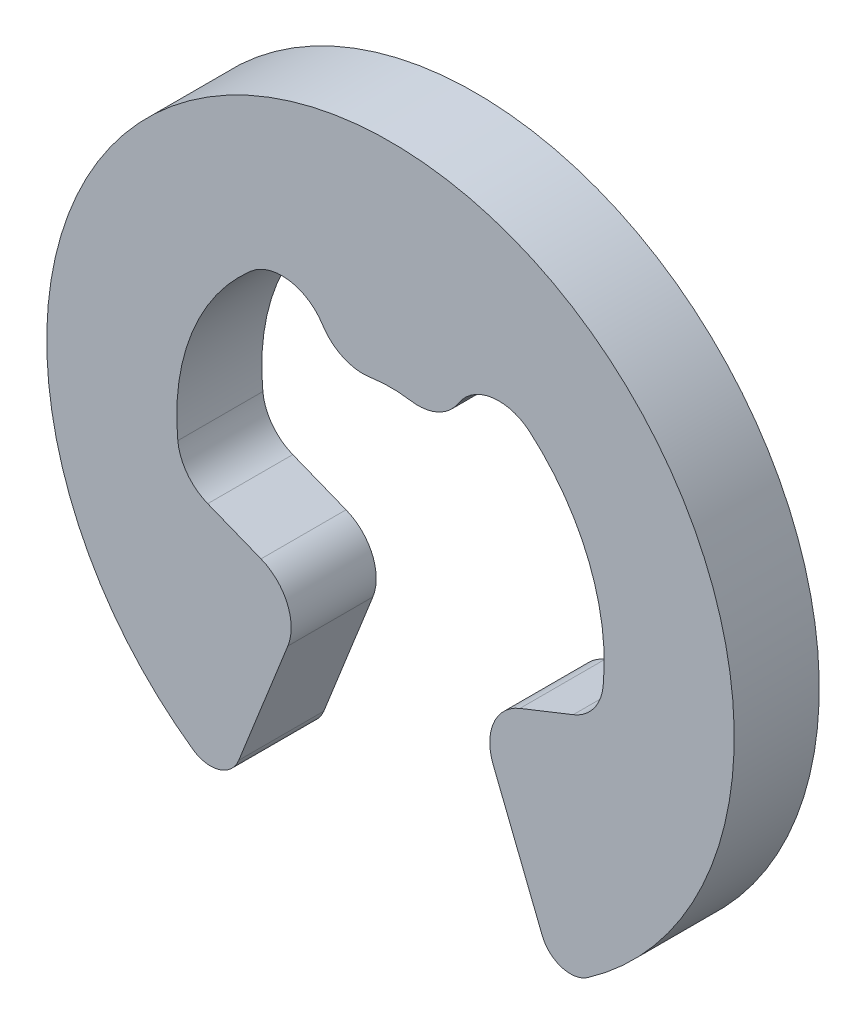
ISO-10303-21;
HEADER;
FILE_DESCRIPTION(('STEP AP214'),'2;1');
FILE_NAME('part.step','',(''),(''),'','','');
FILE_SCHEMA(('AUTOMOTIVE_DESIGN { 1 0 10303 214 1 1 1 1 }'));
ENDSEC;
DATA;
#1=APPLICATION_CONTEXT('core data for automotive mechanical design processes');
#2=APPLICATION_PROTOCOL_DEFINITION('international standard','automotive_design',2000,#1);
#3=PRODUCT_CONTEXT('',#1,'mechanical');
#4=PRODUCT('Part','Part','',(#3));
#5=PRODUCT_RELATED_PRODUCT_CATEGORY('part','',(#4));
#6=PRODUCT_DEFINITION_FORMATION('','',#4);
#7=PRODUCT_DEFINITION_CONTEXT('part definition',#1,'design');
#8=PRODUCT_DEFINITION('design','',#6,#7);
#9=PRODUCT_DEFINITION_SHAPE('','',#8);
#10=(LENGTH_UNIT() NAMED_UNIT(*) SI_UNIT(.MILLI.,.METRE.));
#11=(NAMED_UNIT(*) PLANE_ANGLE_UNIT() SI_UNIT($,.RADIAN.));
#12=(NAMED_UNIT(*) SI_UNIT($,.STERADIAN.) SOLID_ANGLE_UNIT());
#13=UNCERTAINTY_MEASURE_WITH_UNIT(LENGTH_MEASURE(1.E-05),#10,'distance_accuracy_value','');
#14=(GEOMETRIC_REPRESENTATION_CONTEXT(3) GLOBAL_UNCERTAINTY_ASSIGNED_CONTEXT((#13)) GLOBAL_UNIT_ASSIGNED_CONTEXT((#10,
#11,#12)) REPRESENTATION_CONTEXT('',''));
#15=CARTESIAN_POINT('',(0.,0.,0.));
#16=DIRECTION('',(0.,0.,1.));
#17=DIRECTION('',(1.,0.,0.));
#18=AXIS2_PLACEMENT_3D('',#15,#16,#17);
#19=CARTESIAN_POINT('',(0.,0.143506110626121,0.584199999999979));
#20=DIRECTION('',(0.,0.,1.));
#21=DIRECTION('',(1.,0.,0.));
#22=AXIS2_PLACEMENT_3D('',#19,#20,#21);
#23=PLANE('',#22);
#24=CARTESIAN_POINT('',(-1.72616725235582,-0.173879579426703,0.584199999999979));
#25=DIRECTION('',(0.,0.,1.));
#26=DIRECTION('',(1.,0.,0.));
#27=AXIS2_PLACEMENT_3D('',#24,#25,#26);
#28=CIRCLE('',#27,0.500000000000007);
#29=CARTESIAN_POINT('',(-1.91077670836398,-0.638550805943228,0.584199999999979));
#30=VERTEX_POINT('',#29);
#31=CARTESIAN_POINT('',(-2.22364968177859,-0.223991777698424,0.584199999999979));
#32=VERTEX_POINT('',#31);
#33=EDGE_CURVE('E161',#30,#32,#28,.F.);
#34=ORIENTED_EDGE('',*,*,#33,.T.);
#35=CARTESIAN_POINT('',(0.,0.,0.584199999999979));
#36=DIRECTION('',(0.,0.,1.));
#37=DIRECTION('',(1.,0.,0.));
#38=AXIS2_PLACEMENT_3D('',#35,#36,#37);
#39=CIRCLE('',#38,2.23490273250325);
#40=CARTESIAN_POINT('',(-1.4592169871897,1.69277169401179,0.584199999999979));
#41=VERTEX_POINT('',#40);
#42=EDGE_CURVE('E159',#32,#41,#39,.F.);
#43=ORIENTED_EDGE('',*,*,#42,.T.);
#44=CARTESIAN_POINT('',(-1.13275602627905,1.31405908397444,0.584199999999979));
#45=DIRECTION('',(0.,0.,1.));
#46=DIRECTION('',(1.,0.,0.));
#47=AXIS2_PLACEMENT_3D('',#44,#45,#46);
#48=CIRCLE('',#47,0.500000000000007);
#49=CARTESIAN_POINT('',(-0.715008346814609,1.58880783520379,0.584199999999979));
#50=VERTEX_POINT('',#49);
#51=EDGE_CURVE('E20',#41,#50,#48,.F.);
#52=ORIENTED_EDGE('',*,*,#51,.T.);
#53=DIRECTION('',(0.549497502458702,-0.835495358928851,0.));
#54=VECTOR('',#53,1.);
#55=CARTESIAN_POINT('',(-0.715008346814601,1.58880783520378,0.584199999999979));
#56=LINE('',#55,#54);
#57=CARTESIAN_POINT('',(-0.705647848949969,1.57457546383144,0.584199999999979));
#58=VERTEX_POINT('',#57);
#59=EDGE_CURVE('E157',#50,#58,#56,.T.);
#60=ORIENTED_EDGE('',*,*,#59,.T.);
#61=CARTESIAN_POINT('',(-0.28790016948553,1.84932421506079,0.584199999999979));
#62=DIRECTION('',(0.,0.,1.));
#63=DIRECTION('',(1.,0.,0.));
#64=AXIS2_PLACEMENT_3D('',#61,#62,#63);
#65=CIRCLE('',#64,0.500000000000007);
#66=CARTESIAN_POINT('',(-0.210987322326542,1.35527521552542,0.584199999999979));
#67=VERTEX_POINT('',#66);
#68=EDGE_CURVE('E231',#67,#58,#65,.F.);
#69=ORIENTED_EDGE('',*,*,#68,.F.);
#70=CARTESIAN_POINT('',(0.,0.,0.584199999999979));
#71=DIRECTION('',(0.,0.,1.));
#72=DIRECTION('',(1.,0.,0.));
#73=AXIS2_PLACEMENT_3D('',#70,#71,#72);
#74=CIRCLE('',#73,1.3716);
#75=CARTESIAN_POINT('',(0.210987322326542,1.35527521552541,0.584199999999979));
#76=VERTEX_POINT('',#75);
#77=EDGE_CURVE('E230',#67,#76,#74,.F.);
#78=ORIENTED_EDGE('',*,*,#77,.T.);
#79=CARTESIAN_POINT('',(0.28790016948553,1.84932421506079,0.584199999999979));
#80=DIRECTION('',(0.,0.,1.));
#81=DIRECTION('',(1.,0.,0.));
#82=AXIS2_PLACEMENT_3D('',#79,#80,#81);
#83=CIRCLE('',#82,0.500000000000007);
#84=CARTESIAN_POINT('',(0.705647848949927,1.57457546383136,0.584199999999979));
#85=VERTEX_POINT('',#84);
#86=EDGE_CURVE('E226',#85,#76,#83,.F.);
#87=ORIENTED_EDGE('',*,*,#86,.F.);
#88=DIRECTION('',(0.549497502458841,0.835495358928759,0.));
#89=VECTOR('',#88,1.);
#90=CARTESIAN_POINT('',(0.98838354154001,2.00446706098237,0.584199999999979));
#91=LINE('',#90,#89);
#92=CARTESIAN_POINT('',(0.715008346814638,1.58880783520382,0.584199999999979));
#93=VERTEX_POINT('',#92);
#94=EDGE_CURVE('E223',#93,#85,#91,.F.);
#95=ORIENTED_EDGE('',*,*,#94,.F.);
#96=CARTESIAN_POINT('',(1.13275602627905,1.31405908397444,0.584199999999979));
#97=DIRECTION('',(0.,0.,1.));
#98=DIRECTION('',(1.,0.,0.));
#99=AXIS2_PLACEMENT_3D('',#96,#97,#98);
#100=CIRCLE('',#99,0.500000000000007);
#101=CARTESIAN_POINT('',(1.4592169871897,1.69277169401178,0.584199999999979));
#102=VERTEX_POINT('',#101);
#103=EDGE_CURVE('E217',#93,#102,#100,.F.);
#104=ORIENTED_EDGE('',*,*,#103,.T.);
#105=CARTESIAN_POINT('',(0.,0.,0.584199999999979));
#106=DIRECTION('',(0.,0.,1.));
#107=DIRECTION('',(1.,0.,0.));
#108=AXIS2_PLACEMENT_3D('',#105,#106,#107);
#109=CIRCLE('',#108,2.23490273250325);
#110=CARTESIAN_POINT('',(2.22364968177859,-0.223991777698424,0.584199999999979));
#111=VERTEX_POINT('',#110);
#112=EDGE_CURVE('E213',#102,#111,#109,.F.);
#113=ORIENTED_EDGE('',*,*,#112,.T.);
#114=CARTESIAN_POINT('',(1.72616725235582,-0.173879579426703,0.584199999999979));
#115=DIRECTION('',(0.,0.,1.));
#116=DIRECTION('',(1.,0.,0.));
#117=AXIS2_PLACEMENT_3D('',#114,#115,#116);
#118=CIRCLE('',#117,0.500000000000007);
#119=CARTESIAN_POINT('',(1.91077670836398,-0.63855080594322,0.584199999999979));
#120=VERTEX_POINT('',#119);
#121=EDGE_CURVE('E212',#111,#120,#118,.F.);
#122=ORIENTED_EDGE('',*,*,#121,.T.);
#123=DIRECTION('',(-0.929342453033051,-0.369218912016315,0.));
#124=VECTOR('',#123,1.);
#125=CARTESIAN_POINT('',(0.889000000000001,-1.04449296790356,0.584199999999979));
#126=LINE('',#125,#124);
#127=CARTESIAN_POINT('',(1.35367122651652,-0.859883511895409,0.584199999999979));
#128=VERTEX_POINT('',#127);
#129=EDGE_CURVE('E208',#128,#120,#126,.F.);
#130=ORIENTED_EDGE('',*,*,#129,.F.);
#131=CARTESIAN_POINT('',(1.53828068252469,-1.32455473841195,0.584199999999979));
#132=DIRECTION('',(0.,0.,1.));
#133=DIRECTION('',(1.,0.,0.));
#134=AXIS2_PLACEMENT_3D('',#131,#132,#133);
#135=CIRCLE('',#134,0.500000000000007);
#136=CARTESIAN_POINT('',(1.07360945600816,-1.5091641944201,0.584199999999979));
#137=VERTEX_POINT('',#136);
#138=EDGE_CURVE('E205',#137,#128,#135,.F.);
#139=ORIENTED_EDGE('',*,*,#138,.F.);
#140=DIRECTION('',(0.369218912016316,-0.929342453033051,0.));
#141=VECTOR('',#140,1.);
#142=CARTESIAN_POINT('',(1.58637370049063,-2.79981742286013,0.584199999999979));
#143=LINE('',#142,#141);
#144=CARTESIAN_POINT('',(1.58637370049063,-2.79981742286013,0.584199999999979));
#145=VERTEX_POINT('',#144);
#146=EDGE_CURVE('E202',#145,#137,#143,.F.);
#147=ORIENTED_EDGE('',*,*,#146,.F.);
#148=CARTESIAN_POINT('',(1.88143992932862,-2.68259041829494,0.584199999999979));
#149=DIRECTION('',(0.,0.,1.));
#150=DIRECTION('',(1.,0.,0.));
#151=AXIS2_PLACEMENT_3D('',#148,#149,#150);
#152=CIRCLE('',#151,0.3175);
#153=CARTESIAN_POINT('',(2.06375,-2.94253135030028,0.584199999999979));
#154=VERTEX_POINT('',#153);
#155=EDGE_CURVE('E199',#154,#145,#152,.F.);
#156=ORIENTED_EDGE('',*,*,#155,.F.);
#157=CARTESIAN_POINT('',(0.,0.,0.584199999999979));
#158=DIRECTION('',(0.,0.,1.));
#159=DIRECTION('',(1.,0.,0.));
#160=AXIS2_PLACEMENT_3D('',#157,#158,#159);
#161=CIRCLE('',#160,3.5941);
#162=CARTESIAN_POINT('',(-2.06375,-2.94253135030027,0.584199999999979));
#163=VERTEX_POINT('',#162);
#164=EDGE_CURVE('E196',#163,#154,#161,.F.);
#165=ORIENTED_EDGE('',*,*,#164,.F.);
#166=CARTESIAN_POINT('',(-1.88143992932862,-2.68259041829494,0.584199999999979));
#167=DIRECTION('',(0.,0.,1.));
#168=DIRECTION('',(1.,0.,0.));
#169=AXIS2_PLACEMENT_3D('',#166,#167,#168);
#170=CIRCLE('',#169,0.3175);
#171=CARTESIAN_POINT('',(-1.58637370049063,-2.79981742286013,0.584199999999979));
#172=VERTEX_POINT('',#171);
#173=EDGE_CURVE('E193',#172,#163,#170,.F.);
#174=ORIENTED_EDGE('',*,*,#173,.F.);
#175=DIRECTION('',(0.369218912016315,0.929342453033051,0.));
#176=VECTOR('',#175,1.);
#177=CARTESIAN_POINT('',(-0.889000000000001,-1.04449296790356,0.584199999999979));
#178=LINE('',#177,#176);
#179=CARTESIAN_POINT('',(-1.07360945600816,-1.5091641944201,0.584199999999979));
#180=VERTEX_POINT('',#179);
#181=EDGE_CURVE('E187',#180,#172,#178,.F.);
#182=ORIENTED_EDGE('',*,*,#181,.F.);
#183=CARTESIAN_POINT('',(-1.53828068252469,-1.32455473841195,0.584199999999979));
#184=DIRECTION('',(0.,0.,1.));
#185=DIRECTION('',(1.,0.,0.));
#186=AXIS2_PLACEMENT_3D('',#183,#184,#185);
#187=CIRCLE('',#186,0.500000000000007);
#188=CARTESIAN_POINT('',(-1.35367122651652,-0.859883511895401,0.584199999999979));
#189=VERTEX_POINT('',#188);
#190=EDGE_CURVE('E184',#189,#180,#187,.F.);
#191=ORIENTED_EDGE('',*,*,#190,.F.);
#192=DIRECTION('',(-0.929342453033051,0.369218912016315,0.));
#193=VECTOR('',#192,1.);
#194=CARTESIAN_POINT('',(-2.16976024988989,-0.535659109647355,0.584199999999979));
#195=LINE('',#194,#193);
#196=EDGE_CURVE('E180',#30,#189,#195,.F.);
#197=ORIENTED_EDGE('',*,*,#196,.F.);
#198=EDGE_LOOP('',(#34,#43,#52,#60,#69,#78,#87,#95,#104,#113,#122,#130,#139,#147,#156,#165,#174,
#182,#191,#197));
#199=FACE_BOUND('',#198,.T.);
#200=ADVANCED_FACE('F17',(#199),#23,.T.);
#201=CARTESIAN_POINT('',(-0.28790016948553,1.84932421506079,0.));
#202=DIRECTION('',(0.,0.,1.));
#203=DIRECTION('',(1.,0.,0.));
#204=AXIS2_PLACEMENT_3D('',#201,#202,#203);
#205=CYLINDRICAL_SURFACE('',#204,0.500000000000007);
#206=ORIENTED_EDGE('',*,*,#68,.T.);
#207=DIRECTION('',(0.,0.,1.));
#208=VECTOR('',#207,1.);
#209=CARTESIAN_POINT('',(-0.705647848949976,1.57457546383145,0.));
#210=LINE('',#209,#208);
#211=CARTESIAN_POINT('',(-0.705647848949969,1.57457546383144,-0.304799999999994));
#212=VERTEX_POINT('',#211);
#213=EDGE_CURVE('E170',#212,#58,#210,.T.);
#214=ORIENTED_EDGE('',*,*,#213,.F.);
#215=CARTESIAN_POINT('',(-0.28790016948553,1.84932421506079,-0.304799999999994));
#216=DIRECTION('',(0.,0.,1.));
#217=DIRECTION('',(1.,0.,0.));
#218=AXIS2_PLACEMENT_3D('',#215,#216,#217);
#219=CIRCLE('',#218,0.500000000000007);
#220=CARTESIAN_POINT('',(-0.210987322326542,1.35527521552542,-0.304799999999994));
#221=VERTEX_POINT('',#220);
#222=EDGE_CURVE('E277',#212,#221,#219,.T.);
#223=ORIENTED_EDGE('',*,*,#222,.T.);
#224=DIRECTION('',(0.,0.,1.));
#225=VECTOR('',#224,1.);
#226=CARTESIAN_POINT('',(-0.210987322326543,1.35527521552542,0.));
#227=LINE('',#226,#225);
#228=EDGE_CURVE('E227',#221,#67,#227,.T.);
#229=ORIENTED_EDGE('',*,*,#228,.T.);
#230=EDGE_LOOP('',(#206,#214,#223,#229));
#231=FACE_BOUND('',#230,.T.);
#232=ADVANCED_FACE('F296',(#231),#205,.T.);
#233=CARTESIAN_POINT('',(0.,0.,0.));
#234=DIRECTION('',(0.,0.,1.));
#235=DIRECTION('',(1.,0.,0.));
#236=AXIS2_PLACEMENT_3D('',#233,#234,#235);
#237=CYLINDRICAL_SURFACE('',#236,1.3716);
#238=DIRECTION('',(0.,0.,1.));
#239=VECTOR('',#238,1.);
#240=CARTESIAN_POINT('',(0.210987322326544,1.35527521552541,0.));
#241=LINE('',#240,#239);
#242=CARTESIAN_POINT('',(0.210987322326542,1.35527521552541,-0.304799999999994));
#243=VERTEX_POINT('',#242);
#244=EDGE_CURVE('E224',#76,#243,#241,.F.);
#245=ORIENTED_EDGE('',*,*,#244,.F.);
#246=ORIENTED_EDGE('',*,*,#77,.F.);
#247=ORIENTED_EDGE('',*,*,#228,.F.);
#248=CARTESIAN_POINT('',(0.,0.,-0.304799999999994));
#249=DIRECTION('',(0.,0.,1.));
#250=DIRECTION('',(1.,0.,0.));
#251=AXIS2_PLACEMENT_3D('',#248,#249,#250);
#252=CIRCLE('',#251,1.3716);
#253=EDGE_CURVE('E274',#221,#243,#252,.F.);
#254=ORIENTED_EDGE('',*,*,#253,.T.);
#255=EDGE_LOOP('',(#245,#246,#247,#254));
#256=FACE_BOUND('',#255,.T.);
#257=ADVANCED_FACE('F306',(#256),#237,.F.);
#258=CARTESIAN_POINT('',(0.28790016948553,1.84932421506079,0.));
#259=DIRECTION('',(0.,0.,1.));
#260=DIRECTION('',(1.,0.,0.));
#261=AXIS2_PLACEMENT_3D('',#258,#259,#260);
#262=CYLINDRICAL_SURFACE('',#261,0.500000000000007);
#263=ORIENTED_EDGE('',*,*,#86,.T.);
#264=ORIENTED_EDGE('',*,*,#244,.T.);
#265=CARTESIAN_POINT('',(0.28790016948553,1.84932421506079,-0.304799999999994));
#266=DIRECTION('',(0.,0.,1.));
#267=DIRECTION('',(1.,0.,0.));
#268=AXIS2_PLACEMENT_3D('',#265,#266,#267);
#269=CIRCLE('',#268,0.500000000000007);
#270=CARTESIAN_POINT('',(0.705647848949993,1.57457546383147,-0.304799999999994));
#271=VERTEX_POINT('',#270);
#272=EDGE_CURVE('E271',#243,#271,#269,.T.);
#273=ORIENTED_EDGE('',*,*,#272,.T.);
#274=DIRECTION('',(0.,0.,1.));
#275=VECTOR('',#274,1.);
#276=CARTESIAN_POINT('',(0.705647848949927,1.57457546383136,0.));
#277=LINE('',#276,#275);
#278=EDGE_CURVE('E221',#85,#271,#277,.F.);
#279=ORIENTED_EDGE('',*,*,#278,.F.);
#280=EDGE_LOOP('',(#263,#264,#273,#279));
#281=FACE_BOUND('',#280,.T.);
#282=ADVANCED_FACE('F311',(#281),#262,.T.);
#283=CARTESIAN_POINT('',(0.98838354154001,2.00446706098237,0.));
#284=DIRECTION('',(0.835495358928759,-0.549497502458841,0.));
#285=DIRECTION('',(0.549497502458841,0.835495358928759,0.));
#286=AXIS2_PLACEMENT_3D('',#283,#284,#285);
#287=PLANE('',#286);
#288=ORIENTED_EDGE('',*,*,#278,.T.);
#289=DIRECTION('',(0.549497502458418,0.835495358929038,0.));
#290=VECTOR('',#289,1.);
#291=CARTESIAN_POINT('',(0.705647848949983,1.57457546383145,-0.304799999999994));
#292=LINE('',#291,#290);
#293=CARTESIAN_POINT('',(0.715008346814562,1.58880783520372,-0.304799999999994));
#294=VERTEX_POINT('',#293);
#295=EDGE_CURVE('E270',#271,#294,#292,.T.);
#296=ORIENTED_EDGE('',*,*,#295,.T.);
#297=DIRECTION('',(0.,0.,1.));
#298=VECTOR('',#297,1.);
#299=CARTESIAN_POINT('',(0.715008346814602,1.58880783520378,0.));
#300=LINE('',#299,#298);
#301=EDGE_CURVE('E218',#294,#93,#300,.T.);
#302=ORIENTED_EDGE('',*,*,#301,.T.);
#303=ORIENTED_EDGE('',*,*,#94,.T.);
#304=EDGE_LOOP('',(#288,#296,#302,#303));
#305=FACE_BOUND('',#304,.T.);
#306=ADVANCED_FACE('F314',(#305),#287,.T.);
#307=CARTESIAN_POINT('',(1.13275602627905,1.31405908397444,0.));
#308=DIRECTION('',(0.,0.,1.));
#309=DIRECTION('',(1.,0.,0.));
#310=AXIS2_PLACEMENT_3D('',#307,#308,#309);
#311=CYLINDRICAL_SURFACE('',#310,0.500000000000007);
#312=ORIENTED_EDGE('',*,*,#103,.F.);
#313=ORIENTED_EDGE('',*,*,#301,.F.);
#314=CARTESIAN_POINT('',(1.13275602627905,1.31405908397444,-0.304799999999994));
#315=DIRECTION('',(0.,0.,1.));
#316=DIRECTION('',(1.,0.,0.));
#317=AXIS2_PLACEMENT_3D('',#314,#315,#316);
#318=CIRCLE('',#317,0.500000000000007);
#319=CARTESIAN_POINT('',(1.4592169871897,1.69277169401178,-0.304799999999994));
#320=VERTEX_POINT('',#319);
#321=EDGE_CURVE('E267',#294,#320,#318,.F.);
#322=ORIENTED_EDGE('',*,*,#321,.T.);
#323=DIRECTION('',(0.,0.,1.));
#324=VECTOR('',#323,1.);
#325=CARTESIAN_POINT('',(1.4592169871897,1.69277169401178,0.));
#326=LINE('',#325,#324);
#327=EDGE_CURVE('E214',#320,#102,#326,.T.);
#328=ORIENTED_EDGE('',*,*,#327,.T.);
#329=EDGE_LOOP('',(#312,#313,#322,#328));
#330=FACE_BOUND('',#329,.T.);
#331=ADVANCED_FACE('F478',(#330),#311,.F.);
#332=CARTESIAN_POINT('',(0.,0.,0.));
#333=DIRECTION('',(0.,0.,1.));
#334=DIRECTION('',(1.,0.,0.));
#335=AXIS2_PLACEMENT_3D('',#332,#333,#334);
#336=CYLINDRICAL_SURFACE('',#335,2.23490273250325);
#337=CARTESIAN_POINT('',(0.,0.,-0.304799999999994));
#338=DIRECTION('',(0.,0.,1.));
#339=DIRECTION('',(1.,0.,0.));
#340=AXIS2_PLACEMENT_3D('',#337,#338,#339);
#341=CIRCLE('',#340,2.23490273250325);
#342=CARTESIAN_POINT('',(2.22364968177859,-0.223991777698425,-0.304799999999994));
#343=VERTEX_POINT('',#342);
#344=EDGE_CURVE('E265',#320,#343,#341,.F.);
#345=ORIENTED_EDGE('',*,*,#344,.T.);
#346=DIRECTION('',(0.,0.,1.));
#347=VECTOR('',#346,1.);
#348=CARTESIAN_POINT('',(2.22364968177859,-0.223991777698427,0.));
#349=LINE('',#348,#347);
#350=EDGE_CURVE('E209',#343,#111,#349,.T.);
#351=ORIENTED_EDGE('',*,*,#350,.T.);
#352=ORIENTED_EDGE('',*,*,#112,.F.);
#353=ORIENTED_EDGE('',*,*,#327,.F.);
#354=EDGE_LOOP('',(#345,#351,#352,#353));
#355=FACE_BOUND('',#354,.T.);
#356=ADVANCED_FACE('F469',(#355),#336,.F.);
#357=CARTESIAN_POINT('',(1.72616725235582,-0.173879579426703,0.));
#358=DIRECTION('',(0.,0.,1.));
#359=DIRECTION('',(1.,0.,0.));
#360=AXIS2_PLACEMENT_3D('',#357,#358,#359);
#361=CYLINDRICAL_SURFACE('',#360,0.500000000000007);
#362=ORIENTED_EDGE('',*,*,#121,.F.);
#363=ORIENTED_EDGE('',*,*,#350,.F.);
#364=CARTESIAN_POINT('',(1.72616725235582,-0.173879579426703,-0.304799999999994));
#365=DIRECTION('',(0.,0.,1.));
#366=DIRECTION('',(1.,0.,0.));
#367=AXIS2_PLACEMENT_3D('',#364,#365,#366);
#368=CIRCLE('',#367,0.500000000000007);
#369=CARTESIAN_POINT('',(1.91077670836398,-0.638550805943224,-0.304799999999994));
#370=VERTEX_POINT('',#369);
#371=EDGE_CURVE('E262',#343,#370,#368,.F.);
#372=ORIENTED_EDGE('',*,*,#371,.T.);
#373=DIRECTION('',(0.,0.,1.));
#374=VECTOR('',#373,1.);
#375=CARTESIAN_POINT('',(1.91077670836398,-0.638550805943221,0.));
#376=LINE('',#375,#374);
#377=EDGE_CURVE('E206',#120,#370,#376,.F.);
#378=ORIENTED_EDGE('',*,*,#377,.F.);
#379=EDGE_LOOP('',(#362,#363,#372,#378));
#380=FACE_BOUND('',#379,.T.);
#381=ADVANCED_FACE('F460',(#380),#361,.F.);
#382=CARTESIAN_POINT('',(0.889000000000001,-1.04449296790356,0.));
#383=DIRECTION('',(-0.369218912016315,0.929342453033051,0.));
#384=DIRECTION('',(-0.929342453033051,-0.369218912016315,0.));
#385=AXIS2_PLACEMENT_3D('',#382,#383,#384);
#386=PLANE('',#385);
#387=ORIENTED_EDGE('',*,*,#377,.T.);
#388=DIRECTION('',(-0.929342453033051,-0.369218912016314,0.));
#389=VECTOR('',#388,1.);
#390=CARTESIAN_POINT('',(1.91077670836397,-0.63855080594323,-0.304799999999994));
#391=LINE('',#390,#389);
#392=CARTESIAN_POINT('',(1.35367122651652,-0.859883511895413,-0.304799999999994));
#393=VERTEX_POINT('',#392);
#394=EDGE_CURVE('E261',#370,#393,#391,.T.);
#395=ORIENTED_EDGE('',*,*,#394,.T.);
#396=DIRECTION('',(0.,0.,1.));
#397=VECTOR('',#396,1.);
#398=CARTESIAN_POINT('',(1.35367122651653,-0.859883511895417,0.));
#399=LINE('',#398,#397);
#400=EDGE_CURVE('E203',#128,#393,#399,.F.);
#401=ORIENTED_EDGE('',*,*,#400,.F.);
#402=ORIENTED_EDGE('',*,*,#129,.T.);
#403=EDGE_LOOP('',(#387,#395,#401,#402));
#404=FACE_BOUND('',#403,.T.);
#405=ADVANCED_FACE('F451',(#404),#386,.T.);
#406=CARTESIAN_POINT('',(1.53828068252469,-1.32455473841195,0.));
#407=DIRECTION('',(0.,0.,1.));
#408=DIRECTION('',(1.,0.,0.));
#409=AXIS2_PLACEMENT_3D('',#406,#407,#408);
#410=CYLINDRICAL_SURFACE('',#409,0.500000000000007);
#411=ORIENTED_EDGE('',*,*,#138,.T.);
#412=ORIENTED_EDGE('',*,*,#400,.T.);
#413=CARTESIAN_POINT('',(1.53828068252469,-1.32455473841195,-0.304799999999994));
#414=DIRECTION('',(0.,0.,1.));
#415=DIRECTION('',(1.,0.,0.));
#416=AXIS2_PLACEMENT_3D('',#413,#414,#415);
#417=CIRCLE('',#416,0.500000000000007);
#418=CARTESIAN_POINT('',(1.07360945600816,-1.5091641944201,-0.304799999999994));
#419=VERTEX_POINT('',#418);
#420=EDGE_CURVE('E258',#393,#419,#417,.T.);
#421=ORIENTED_EDGE('',*,*,#420,.T.);
#422=DIRECTION('',(0.,0.,1.));
#423=VECTOR('',#422,1.);
#424=CARTESIAN_POINT('',(1.07360945600816,-1.5091641944201,0.));
#425=LINE('',#424,#423);
#426=EDGE_CURVE('E200',#137,#419,#425,.F.);
#427=ORIENTED_EDGE('',*,*,#426,.F.);
#428=EDGE_LOOP('',(#411,#412,#421,#427));
#429=FACE_BOUND('',#428,.T.);
#430=ADVANCED_FACE('F442',(#429),#410,.T.);
#431=CARTESIAN_POINT('',(1.58637370049063,-2.79981742286013,0.));
#432=DIRECTION('',(-0.929342453033051,-0.369218912016316,0.));
#433=DIRECTION('',(0.369218912016316,-0.929342453033051,0.));
#434=AXIS2_PLACEMENT_3D('',#431,#432,#433);
#435=PLANE('',#434);
#436=ORIENTED_EDGE('',*,*,#426,.T.);
#437=DIRECTION('',(0.369218912016312,-0.929342453033052,0.));
#438=VECTOR('',#437,1.);
#439=CARTESIAN_POINT('',(1.07360945600816,-1.5091641944201,-0.304799999999994));
#440=LINE('',#439,#438);
#441=CARTESIAN_POINT('',(1.58637370049063,-2.79981742286013,-0.304799999999994));
#442=VERTEX_POINT('',#441);
#443=EDGE_CURVE('E257',#419,#442,#440,.T.);
#444=ORIENTED_EDGE('',*,*,#443,.T.);
#445=DIRECTION('',(0.,0.,1.));
#446=VECTOR('',#445,1.);
#447=CARTESIAN_POINT('',(1.58637370049063,-2.79981742286013,0.));
#448=LINE('',#447,#446);
#449=EDGE_CURVE('E197',#145,#442,#448,.F.);
#450=ORIENTED_EDGE('',*,*,#449,.F.);
#451=ORIENTED_EDGE('',*,*,#146,.T.);
#452=EDGE_LOOP('',(#436,#444,#450,#451));
#453=FACE_BOUND('',#452,.T.);
#454=ADVANCED_FACE('F433',(#453),#435,.T.);
#455=CARTESIAN_POINT('',(1.88143992932862,-2.68259041829494,0.));
#456=DIRECTION('',(0.,0.,1.));
#457=DIRECTION('',(1.,0.,0.));
#458=AXIS2_PLACEMENT_3D('',#455,#456,#457);
#459=CYLINDRICAL_SURFACE('',#458,0.3175);
#460=ORIENTED_EDGE('',*,*,#155,.T.);
#461=ORIENTED_EDGE('',*,*,#449,.T.);
#462=CARTESIAN_POINT('',(1.88143992932862,-2.68259041829494,-0.304799999999994));
#463=DIRECTION('',(0.,0.,1.));
#464=DIRECTION('',(1.,0.,0.));
#465=AXIS2_PLACEMENT_3D('',#462,#463,#464);
#466=CIRCLE('',#465,0.3175);
#467=CARTESIAN_POINT('',(2.06375,-2.94253135030028,-0.304799999999994));
#468=VERTEX_POINT('',#467);
#469=EDGE_CURVE('E254',#442,#468,#466,.T.);
#470=ORIENTED_EDGE('',*,*,#469,.T.);
#471=DIRECTION('',(0.,0.,1.));
#472=VECTOR('',#471,1.);
#473=CARTESIAN_POINT('',(2.06375,-2.94253135030028,0.));
#474=LINE('',#473,#472);
#475=EDGE_CURVE('E194',#154,#468,#474,.F.);
#476=ORIENTED_EDGE('',*,*,#475,.F.);
#477=EDGE_LOOP('',(#460,#461,#470,#476));
#478=FACE_BOUND('',#477,.T.);
#479=ADVANCED_FACE('F424',(#478),#459,.T.);
#480=CARTESIAN_POINT('',(0.,0.,0.));
#481=DIRECTION('',(0.,0.,1.));
#482=DIRECTION('',(1.,0.,0.));
#483=AXIS2_PLACEMENT_3D('',#480,#481,#482);
#484=CYLINDRICAL_SURFACE('',#483,3.5941);
#485=DIRECTION('',(0.,0.,1.));
#486=VECTOR('',#485,1.);
#487=CARTESIAN_POINT('',(-2.06374999999999,-2.94253135030027,0.));
#488=LINE('',#487,#486);
#489=CARTESIAN_POINT('',(-2.06375,-2.94253135030027,-0.304799999999994));
#490=VERTEX_POINT('',#489);
#491=EDGE_CURVE('E190',#163,#490,#488,.F.);
#492=ORIENTED_EDGE('',*,*,#491,.F.);
#493=ORIENTED_EDGE('',*,*,#164,.T.);
#494=ORIENTED_EDGE('',*,*,#475,.T.);
#495=CARTESIAN_POINT('',(0.,0.,-0.304799999999994));
#496=DIRECTION('',(0.,0.,1.));
#497=DIRECTION('',(1.,0.,0.));
#498=AXIS2_PLACEMENT_3D('',#495,#496,#497);
#499=CIRCLE('',#498,3.5941);
#500=EDGE_CURVE('E252',#468,#490,#499,.T.);
#501=ORIENTED_EDGE('',*,*,#500,.T.);
#502=EDGE_LOOP('',(#492,#493,#494,#501));
#503=FACE_BOUND('',#502,.T.);
#504=ADVANCED_FACE('F415',(#503),#484,.T.);
#505=CARTESIAN_POINT('',(-1.88143992932862,-2.68259041829494,0.));
#506=DIRECTION('',(0.,0.,1.));
#507=DIRECTION('',(1.,0.,0.));
#508=AXIS2_PLACEMENT_3D('',#505,#506,#507);
#509=CYLINDRICAL_SURFACE('',#508,0.3175);
#510=ORIENTED_EDGE('',*,*,#173,.T.);
#511=ORIENTED_EDGE('',*,*,#491,.T.);
#512=CARTESIAN_POINT('',(-1.88143992932862,-2.68259041829494,-0.304799999999994));
#513=DIRECTION('',(0.,0.,1.));
#514=DIRECTION('',(1.,0.,0.));
#515=AXIS2_PLACEMENT_3D('',#512,#513,#514);
#516=CIRCLE('',#515,0.3175);
#517=CARTESIAN_POINT('',(-1.58637370049063,-2.79981742286013,-0.304799999999994));
#518=VERTEX_POINT('',#517);
#519=EDGE_CURVE('E249',#490,#518,#516,.T.);
#520=ORIENTED_EDGE('',*,*,#519,.T.);
#521=DIRECTION('',(0.,0.,1.));
#522=VECTOR('',#521,1.);
#523=CARTESIAN_POINT('',(-1.58637370049063,-2.79981742286013,0.));
#524=LINE('',#523,#522);
#525=EDGE_CURVE('E188',#172,#518,#524,.F.);
#526=ORIENTED_EDGE('',*,*,#525,.F.);
#527=EDGE_LOOP('',(#510,#511,#520,#526));
#528=FACE_BOUND('',#527,.T.);
#529=ADVANCED_FACE('F406',(#528),#509,.T.);
#530=CARTESIAN_POINT('',(-0.889000000000001,-1.04449296790356,0.));
#531=DIRECTION('',(0.929342453033051,-0.369218912016315,0.));
#532=DIRECTION('',(0.369218912016315,0.929342453033051,0.));
#533=AXIS2_PLACEMENT_3D('',#530,#531,#532);
#534=PLANE('',#533);
#535=DIRECTION('',(0.,0.,1.));
#536=VECTOR('',#535,1.);
#537=CARTESIAN_POINT('',(-1.07360945600815,-1.5091641944201,0.));
#538=LINE('',#537,#536);
#539=CARTESIAN_POINT('',(-1.07360945600816,-1.5091641944201,-0.304799999999994));
#540=VERTEX_POINT('',#539);
#541=EDGE_CURVE('E185',#180,#540,#538,.F.);
#542=ORIENTED_EDGE('',*,*,#541,.F.);
#543=ORIENTED_EDGE('',*,*,#181,.T.);
#544=ORIENTED_EDGE('',*,*,#525,.T.);
#545=DIRECTION('',(0.369218912016316,0.92934245303305,0.));
#546=VECTOR('',#545,1.);
#547=CARTESIAN_POINT('',(-1.58637370049063,-2.79981742286013,-0.304799999999994));
#548=LINE('',#547,#546);
#549=EDGE_CURVE('E248',#518,#540,#548,.T.);
#550=ORIENTED_EDGE('',*,*,#549,.T.);
#551=EDGE_LOOP('',(#542,#543,#544,#550));
#552=FACE_BOUND('',#551,.T.);
#553=ADVANCED_FACE('F397',(#552),#534,.T.);
#554=CARTESIAN_POINT('',(-1.53828068252469,-1.32455473841195,0.));
#555=DIRECTION('',(0.,0.,1.));
#556=DIRECTION('',(1.,0.,0.));
#557=AXIS2_PLACEMENT_3D('',#554,#555,#556);
#558=CYLINDRICAL_SURFACE('',#557,0.500000000000007);
#559=DIRECTION('',(0.,0.,1.));
#560=VECTOR('',#559,1.);
#561=CARTESIAN_POINT('',(-1.35367122651652,-0.859883511895401,0.));
#562=LINE('',#561,#560);
#563=CARTESIAN_POINT('',(-1.35367122651653,-0.859883511895395,-0.304799999999994));
#564=VERTEX_POINT('',#563);
#565=EDGE_CURVE('E181',#189,#564,#562,.F.);
#566=ORIENTED_EDGE('',*,*,#565,.F.);
#567=ORIENTED_EDGE('',*,*,#190,.T.);
#568=ORIENTED_EDGE('',*,*,#541,.T.);
#569=CARTESIAN_POINT('',(-1.53828068252469,-1.32455473841195,-0.304799999999994));
#570=DIRECTION('',(0.,0.,1.));
#571=DIRECTION('',(1.,0.,0.));
#572=AXIS2_PLACEMENT_3D('',#569,#570,#571);
#573=CIRCLE('',#572,0.500000000000007);
#574=EDGE_CURVE('E246',#540,#564,#573,.T.);
#575=ORIENTED_EDGE('',*,*,#574,.T.);
#576=EDGE_LOOP('',(#566,#567,#568,#575));
#577=FACE_BOUND('',#576,.T.);
#578=ADVANCED_FACE('F343',(#577),#558,.T.);
#579=CARTESIAN_POINT('',(-2.16976024988989,-0.535659109647355,0.));
#580=DIRECTION('',(0.369218912016315,0.929342453033051,0.));
#581=DIRECTION('',(-0.929342453033051,0.369218912016315,0.));
#582=AXIS2_PLACEMENT_3D('',#579,#580,#581);
#583=PLANE('',#582);
#584=DIRECTION('',(0.,0.,1.));
#585=VECTOR('',#584,1.);
#586=CARTESIAN_POINT('',(-1.91077670836398,-0.638550805943237,0.));
#587=LINE('',#586,#585);
#588=CARTESIAN_POINT('',(-1.91077670836397,-0.638550805943244,-0.304799999999994));
#589=VERTEX_POINT('',#588);
#590=EDGE_CURVE('E177',#589,#30,#587,.T.);
#591=ORIENTED_EDGE('',*,*,#590,.T.);
#592=ORIENTED_EDGE('',*,*,#196,.T.);
#593=ORIENTED_EDGE('',*,*,#565,.T.);
#594=DIRECTION('',(-0.929342453033069,0.36921891201627,0.));
#595=VECTOR('',#594,1.);
#596=CARTESIAN_POINT('',(-1.35367122651653,-0.859883511895393,-0.304799999999994));
#597=LINE('',#596,#595);
#598=EDGE_CURVE('E245',#564,#589,#597,.T.);
#599=ORIENTED_EDGE('',*,*,#598,.T.);
#600=EDGE_LOOP('',(#591,#592,#593,#599));
#601=FACE_BOUND('',#600,.T.);
#602=ADVANCED_FACE('F328',(#601),#583,.T.);
#603=CARTESIAN_POINT('',(-1.72616725235582,-0.173879579426703,0.));
#604=DIRECTION('',(0.,0.,1.));
#605=DIRECTION('',(1.,0.,0.));
#606=AXIS2_PLACEMENT_3D('',#603,#604,#605);
#607=CYLINDRICAL_SURFACE('',#606,0.500000000000007);
#608=ORIENTED_EDGE('',*,*,#33,.F.);
#609=ORIENTED_EDGE('',*,*,#590,.F.);
#610=CARTESIAN_POINT('',(-1.72616725235582,-0.173879579426703,-0.304799999999994));
#611=DIRECTION('',(0.,0.,1.));
#612=DIRECTION('',(1.,0.,0.));
#613=AXIS2_PLACEMENT_3D('',#610,#611,#612);
#614=CIRCLE('',#613,0.500000000000007);
#615=CARTESIAN_POINT('',(-2.22364968177858,-0.223991777698424,-0.304799999999994));
#616=VERTEX_POINT('',#615);
#617=EDGE_CURVE('E242',#589,#616,#614,.F.);
#618=ORIENTED_EDGE('',*,*,#617,.T.);
#619=DIRECTION('',(0.,0.,1.));
#620=VECTOR('',#619,1.);
#621=CARTESIAN_POINT('',(-2.22364968177858,-0.223991777698426,0.));
#622=LINE('',#621,#620);
#623=EDGE_CURVE('E164',#616,#32,#622,.T.);
#624=ORIENTED_EDGE('',*,*,#623,.T.);
#625=EDGE_LOOP('',(#608,#609,#618,#624));
#626=FACE_BOUND('',#625,.T.);
#627=ADVANCED_FACE('F334',(#626),#607,.F.);
#628=CARTESIAN_POINT('',(0.,0.,0.));
#629=DIRECTION('',(0.,0.,1.));
#630=DIRECTION('',(1.,0.,0.));
#631=AXIS2_PLACEMENT_3D('',#628,#629,#630);
#632=CYLINDRICAL_SURFACE('',#631,2.23490273250325);
#633=ORIENTED_EDGE('',*,*,#623,.F.);
#634=CARTESIAN_POINT('',(0.,0.,-0.304799999999994));
#635=DIRECTION('',(0.,0.,1.));
#636=DIRECTION('',(1.,0.,0.));
#637=AXIS2_PLACEMENT_3D('',#634,#635,#636);
#638=CIRCLE('',#637,2.23490273250325);
#639=CARTESIAN_POINT('',(-1.4592169871897,1.69277169401179,-0.304799999999994));
#640=VERTEX_POINT('',#639);
#641=EDGE_CURVE('E169',#616,#640,#638,.F.);
#642=ORIENTED_EDGE('',*,*,#641,.T.);
#643=DIRECTION('',(0.,0.,1.));
#644=VECTOR('',#643,1.);
#645=CARTESIAN_POINT('',(-1.4592169871897,1.69277169401179,0.));
#646=LINE('',#645,#644);
#647=EDGE_CURVE('E154',#640,#41,#646,.T.);
#648=ORIENTED_EDGE('',*,*,#647,.T.);
#649=ORIENTED_EDGE('',*,*,#42,.F.);
#650=EDGE_LOOP('',(#633,#642,#648,#649));
#651=FACE_BOUND('',#650,.T.);
#652=ADVANCED_FACE('F167',(#651),#632,.F.);
#653=CARTESIAN_POINT('',(-1.13275602627905,1.31405908397444,0.));
#654=DIRECTION('',(0.,0.,1.));
#655=DIRECTION('',(1.,0.,0.));
#656=AXIS2_PLACEMENT_3D('',#653,#654,#655);
#657=CYLINDRICAL_SURFACE('',#656,0.500000000000007);
#658=ORIENTED_EDGE('',*,*,#51,.F.);
#659=ORIENTED_EDGE('',*,*,#647,.F.);
#660=CARTESIAN_POINT('',(-1.13275602627905,1.31405908397444,-0.304799999999994));
#661=DIRECTION('',(0.,0.,1.));
#662=DIRECTION('',(1.,0.,0.));
#663=AXIS2_PLACEMENT_3D('',#660,#661,#662);
#664=CIRCLE('',#663,0.500000000000007);
#665=CARTESIAN_POINT('',(-0.715008346814609,1.58880783520379,-0.304799999999994));
#666=VERTEX_POINT('',#665);
#667=EDGE_CURVE('E26',#640,#666,#664,.F.);
#668=ORIENTED_EDGE('',*,*,#667,.T.);
#669=DIRECTION('',(0.,0.,1.));
#670=VECTOR('',#669,1.);
#671=CARTESIAN_POINT('',(-0.715008346814603,1.58880783520378,0.));
#672=LINE('',#671,#670);
#673=EDGE_CURVE('E34',#50,#666,#672,.F.);
#674=ORIENTED_EDGE('',*,*,#673,.F.);
#675=EDGE_LOOP('',(#658,#659,#668,#674));
#676=FACE_BOUND('',#675,.T.);
#677=ADVANCED_FACE('F151',(#676),#657,.F.);
#678=CARTESIAN_POINT('',(-0.508000000000002,1.27405751832482,0.));
#679=DIRECTION('',(-0.835495358928759,-0.549497502458842,0.));
#680=DIRECTION('',(0.549497502458842,-0.835495358928759,0.));
#681=AXIS2_PLACEMENT_3D('',#678,#679,#680);
#682=PLANE('',#681);
#683=ORIENTED_EDGE('',*,*,#673,.T.);
#684=DIRECTION('',(0.549497502458702,-0.835495358928851,0.));
#685=VECTOR('',#684,1.);
#686=CARTESIAN_POINT('',(-0.715008346814601,1.58880783520378,-0.304799999999994));
#687=LINE('',#686,#685);
#688=EDGE_CURVE('E11',#666,#212,#687,.T.);
#689=ORIENTED_EDGE('',*,*,#688,.T.);
#690=ORIENTED_EDGE('',*,*,#213,.T.);
#691=ORIENTED_EDGE('',*,*,#59,.F.);
#692=EDGE_LOOP('',(#683,#689,#690,#691));
#693=FACE_BOUND('',#692,.T.);
#694=ADVANCED_FACE('F298',(#693),#682,.T.);
#695=CARTESIAN_POINT('',(0.,0.143506110626121,-0.304799999999994));
#696=DIRECTION('',(0.,0.,1.));
#697=DIRECTION('',(1.,0.,0.));
#698=AXIS2_PLACEMENT_3D('',#695,#696,#697);
#699=PLANE('',#698);
#700=ORIENTED_EDGE('',*,*,#667,.F.);
#701=ORIENTED_EDGE('',*,*,#641,.F.);
#702=ORIENTED_EDGE('',*,*,#617,.F.);
#703=ORIENTED_EDGE('',*,*,#598,.F.);
#704=ORIENTED_EDGE('',*,*,#574,.F.);
#705=ORIENTED_EDGE('',*,*,#549,.F.);
#706=ORIENTED_EDGE('',*,*,#519,.F.);
#707=ORIENTED_EDGE('',*,*,#500,.F.);
#708=ORIENTED_EDGE('',*,*,#469,.F.);
#709=ORIENTED_EDGE('',*,*,#443,.F.);
#710=ORIENTED_EDGE('',*,*,#420,.F.);
#711=ORIENTED_EDGE('',*,*,#394,.F.);
#712=ORIENTED_EDGE('',*,*,#371,.F.);
#713=ORIENTED_EDGE('',*,*,#344,.F.);
#714=ORIENTED_EDGE('',*,*,#321,.F.);
#715=ORIENTED_EDGE('',*,*,#295,.F.);
#716=ORIENTED_EDGE('',*,*,#272,.F.);
#717=ORIENTED_EDGE('',*,*,#253,.F.);
#718=ORIENTED_EDGE('',*,*,#222,.F.);
#719=ORIENTED_EDGE('',*,*,#688,.F.);
#720=EDGE_LOOP('',(#700,#701,#702,#703,#704,#705,#706,#707,#708,#709,#710,#711,#712,#713,#714,
#715,#716,#717,#718,#719));
#721=FACE_BOUND('',#720,.T.);
#722=ADVANCED_FACE('F300',(#721),#699,.F.);
#723=CLOSED_SHELL('',(#200,#232,#257,#282,#306,#331,#356,#381,#405,#430,#454,#479,#504,#529,
#553,#578,#602,#627,#652,#677,#694,#722));
#724=MANIFOLD_SOLID_BREP('B1',#723);
#725=ADVANCED_BREP_SHAPE_REPRESENTATION('',(#18,#724),#14);
#726=SHAPE_DEFINITION_REPRESENTATION(#9,#725);
ENDSEC;
END-ISO-10303-21;
